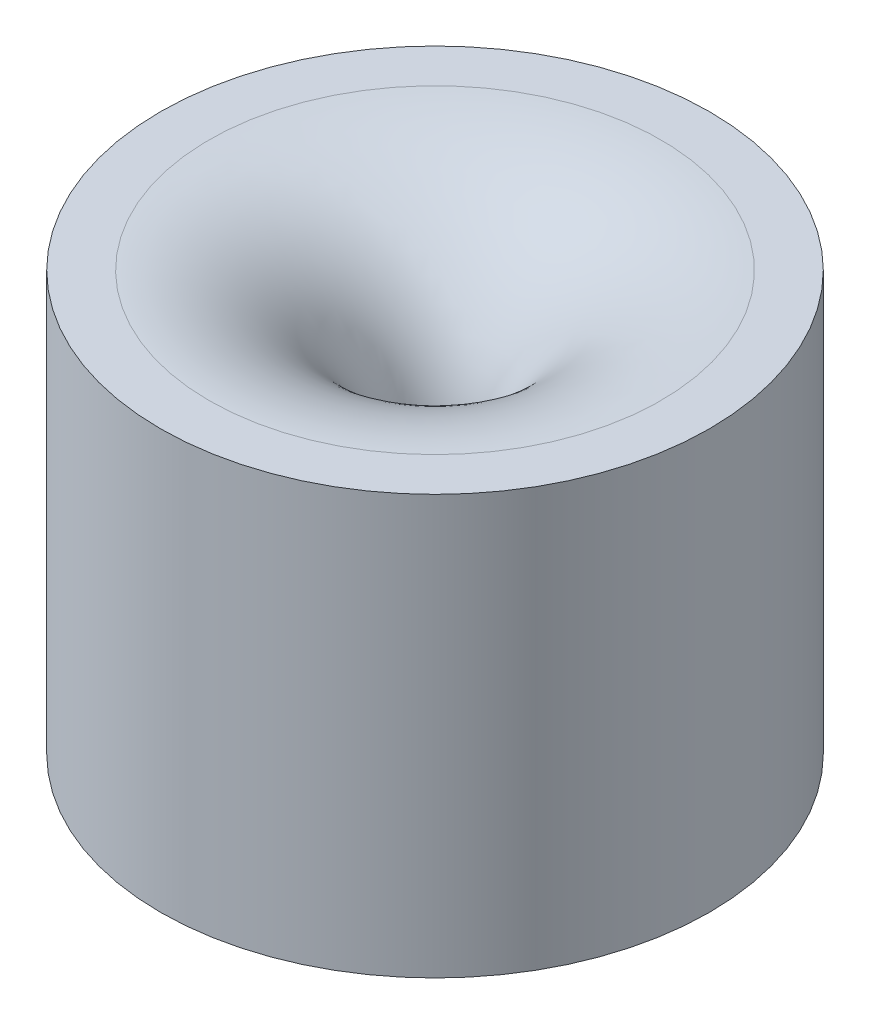
ISO-10303-21;
HEADER;
FILE_DESCRIPTION(('STEP AP214'),'2;1');
FILE_NAME('part.step','',(''),(''),'','','');
FILE_SCHEMA(('AUTOMOTIVE_DESIGN { 1 0 10303 214 1 1 1 1 }'));
ENDSEC;
DATA;
#1=APPLICATION_CONTEXT('core data for automotive mechanical design processes');
#2=APPLICATION_PROTOCOL_DEFINITION('international standard','automotive_design',2000,#1);
#3=PRODUCT_CONTEXT('',#1,'mechanical');
#4=PRODUCT('Part','Part','',(#3));
#5=PRODUCT_RELATED_PRODUCT_CATEGORY('part','',(#4));
#6=PRODUCT_DEFINITION_FORMATION('','',#4);
#7=PRODUCT_DEFINITION_CONTEXT('part definition',#1,'design');
#8=PRODUCT_DEFINITION('design','',#6,#7);
#9=PRODUCT_DEFINITION_SHAPE('','',#8);
#10=(LENGTH_UNIT() NAMED_UNIT(*) SI_UNIT(.MILLI.,.METRE.));
#11=(NAMED_UNIT(*) PLANE_ANGLE_UNIT() SI_UNIT($,.RADIAN.));
#12=(NAMED_UNIT(*) SI_UNIT($,.STERADIAN.) SOLID_ANGLE_UNIT());
#13=UNCERTAINTY_MEASURE_WITH_UNIT(LENGTH_MEASURE(1.E-05),#10,'distance_accuracy_value','');
#14=(GEOMETRIC_REPRESENTATION_CONTEXT(3) GLOBAL_UNCERTAINTY_ASSIGNED_CONTEXT((#13)) GLOBAL_UNIT_ASSIGNED_CONTEXT((#10,
#11,#12)) REPRESENTATION_CONTEXT('',''));
#15=CARTESIAN_POINT('',(0.,0.,0.));
#16=DIRECTION('',(0.,0.,1.));
#17=DIRECTION('',(1.,0.,0.));
#18=AXIS2_PLACEMENT_3D('',#15,#16,#17);
#19=CARTESIAN_POINT('',(0.,44.5,0.));
#20=DIRECTION('',(0.,-1.,0.));
#21=DIRECTION('',(0.,0.,-1.));
#22=AXIS2_PLACEMENT_3D('',#19,#20,#21);
#23=CYLINDRICAL_SURFACE('',#22,4.);
#24=CARTESIAN_POINT('',(0.,24.5,0.));
#25=DIRECTION('',(0.,1.,0.));
#26=DIRECTION('',(0.,0.,1.));
#27=AXIS2_PLACEMENT_3D('',#24,#25,#26);
#28=CIRCLE('',#27,4.);
#29=CARTESIAN_POINT('',(0.,24.5,4.));
#30=VERTEX_POINT('',#29);
#31=EDGE_CURVE('E52',#30,#30,#28,.T.);
#32=ORIENTED_EDGE('',*,*,#31,.T.);
#33=EDGE_LOOP('',(#32));
#34=FACE_BOUND('',#33,.T.);
#35=CARTESIAN_POINT('',(0.,10.,0.));
#36=DIRECTION('',(0.,-1.,0.));
#37=DIRECTION('',(0.,0.,-1.));
#38=AXIS2_PLACEMENT_3D('',#35,#36,#37);
#39=CIRCLE('',#38,4.);
#40=CARTESIAN_POINT('',(0.,10.,-4.));
#41=VERTEX_POINT('',#40);
#42=EDGE_CURVE('E47',#41,#41,#39,.T.);
#43=ORIENTED_EDGE('',*,*,#42,.T.);
#44=EDGE_LOOP('',(#43));
#45=FACE_BOUND('',#44,.T.);
#46=ADVANCED_FACE('F43',(#34,#45),#23,.F.);
#47=CARTESIAN_POINT('',(0.,44.5,0.));
#48=DIRECTION('',(0.,1.,0.));
#49=DIRECTION('',(0.,0.,1.));
#50=AXIS2_PLACEMENT_3D('',#47,#48,#49);
#51=PLANE('',#50);
#52=CARTESIAN_POINT('',(0.,44.5,0.));
#53=DIRECTION('',(0.,1.,0.));
#54=DIRECTION('',(0.,0.,1.));
#55=AXIS2_PLACEMENT_3D('',#52,#53,#54);
#56=CIRCLE('',#55,24.);
#57=CARTESIAN_POINT('',(0.,44.5,24.));
#58=VERTEX_POINT('',#57);
#59=EDGE_CURVE('E10',#58,#58,#56,.F.);
#60=ORIENTED_EDGE('',*,*,#59,.T.);
#61=EDGE_LOOP('',(#60));
#62=FACE_BOUND('',#61,.T.);
#63=CARTESIAN_POINT('',(0.,44.5,0.));
#64=DIRECTION('',(0.,1.,0.));
#65=DIRECTION('',(0.,0.,1.));
#66=AXIS2_PLACEMENT_3D('',#63,#64,#65);
#67=CIRCLE('',#66,29.175);
#68=CARTESIAN_POINT('',(0.,44.5,29.175));
#69=VERTEX_POINT('',#68);
#70=EDGE_CURVE('E57',#69,#69,#67,.T.);
#71=ORIENTED_EDGE('',*,*,#70,.T.);
#72=EDGE_LOOP('',(#71));
#73=FACE_BOUND('',#72,.T.);
#74=ADVANCED_FACE('F91',(#62,#73),#51,.T.);
#75=CARTESIAN_POINT('',(0.,0.,0.));
#76=DIRECTION('',(0.,1.,0.));
#77=DIRECTION('',(0.,0.,1.));
#78=AXIS2_PLACEMENT_3D('',#75,#76,#77);
#79=PLANE('',#78);
#80=CARTESIAN_POINT('',(0.,0.,0.));
#81=DIRECTION('',(0.,-1.,0.));
#82=DIRECTION('',(0.,0.,-1.));
#83=AXIS2_PLACEMENT_3D('',#80,#81,#82);
#84=CIRCLE('',#83,11.);
#85=CARTESIAN_POINT('',(0.,0.,-11.));
#86=VERTEX_POINT('',#85);
#87=EDGE_CURVE('E67',#86,#86,#84,.T.);
#88=ORIENTED_EDGE('',*,*,#87,.F.);
#89=EDGE_LOOP('',(#88));
#90=FACE_BOUND('',#89,.T.);
#91=CARTESIAN_POINT('',(0.,0.,0.));
#92=DIRECTION('',(0.,1.,0.));
#93=DIRECTION('',(0.,0.,1.));
#94=AXIS2_PLACEMENT_3D('',#91,#92,#93);
#95=CIRCLE('',#94,29.175);
#96=CARTESIAN_POINT('',(0.,0.,29.175));
#97=VERTEX_POINT('',#96);
#98=EDGE_CURVE('E60',#97,#97,#95,.T.);
#99=ORIENTED_EDGE('',*,*,#98,.F.);
#100=EDGE_LOOP('',(#99));
#101=FACE_BOUND('',#100,.T.);
#102=ADVANCED_FACE('F97',(#90,#101),#79,.F.);
#103=CARTESIAN_POINT('',(0.,44.5,0.));
#104=DIRECTION('',(0.,-1.,0.));
#105=DIRECTION('',(0.,0.,-1.));
#106=AXIS2_PLACEMENT_3D('',#103,#104,#105);
#107=CYLINDRICAL_SURFACE('',#106,29.175);
#108=ORIENTED_EDGE('',*,*,#70,.F.);
#109=EDGE_LOOP('',(#108));
#110=FACE_BOUND('',#109,.T.);
#111=ORIENTED_EDGE('',*,*,#98,.T.);
#112=EDGE_LOOP('',(#111));
#113=FACE_BOUND('',#112,.T.);
#114=ADVANCED_FACE('F101',(#110,#113),#107,.T.);
#115=CARTESIAN_POINT('',(0.,24.5,0.));
#116=DIRECTION('',(0.,1.,0.));
#117=DIRECTION('',(0.,0.,1.));
#118=AXIS2_PLACEMENT_3D('',#115,#116,#117);
#119=TOROIDAL_SURFACE('',#118,24.,20.);
#120=ORIENTED_EDGE('',*,*,#59,.F.);
#121=EDGE_LOOP('',(#120));
#122=FACE_BOUND('',#121,.T.);
#123=ORIENTED_EDGE('',*,*,#31,.F.);
#124=EDGE_LOOP('',(#123));
#125=FACE_BOUND('',#124,.T.);
#126=ADVANCED_FACE('F45',(#122,#125),#119,.T.);
#127=CARTESIAN_POINT('',(0.,10.,0.));
#128=DIRECTION('',(0.,-1.,0.));
#129=DIRECTION('',(0.,0.,-1.));
#130=AXIS2_PLACEMENT_3D('',#127,#128,#129);
#131=CYLINDRICAL_SURFACE('',#130,11.);
#132=CARTESIAN_POINT('',(0.,10.,0.));
#133=DIRECTION('',(0.,-1.,0.));
#134=DIRECTION('',(0.,0.,-1.));
#135=AXIS2_PLACEMENT_3D('',#132,#133,#134);
#136=CIRCLE('',#135,11.);
#137=CARTESIAN_POINT('',(0.,10.,-11.));
#138=VERTEX_POINT('',#137);
#139=EDGE_CURVE('E71',#138,#138,#136,.T.);
#140=ORIENTED_EDGE('',*,*,#139,.F.);
#141=EDGE_LOOP('',(#140));
#142=FACE_BOUND('',#141,.T.);
#143=ORIENTED_EDGE('',*,*,#87,.T.);
#144=EDGE_LOOP('',(#143));
#145=FACE_BOUND('',#144,.T.);
#146=ADVANCED_FACE('F83',(#142,#145),#131,.F.);
#147=CARTESIAN_POINT('',(0.,10.,0.));
#148=DIRECTION('',(0.,-1.,0.));
#149=DIRECTION('',(0.,0.,-1.));
#150=AXIS2_PLACEMENT_3D('',#147,#148,#149);
#151=PLANE('',#150);
#152=ORIENTED_EDGE('',*,*,#42,.F.);
#153=EDGE_LOOP('',(#152));
#154=FACE_BOUND('',#153,.T.);
#155=ORIENTED_EDGE('',*,*,#139,.T.);
#156=EDGE_LOOP('',(#155));
#157=FACE_BOUND('',#156,.T.);
#158=ADVANCED_FACE('F81',(#154,#157),#151,.T.);
#159=CLOSED_SHELL('',(#46,#74,#102,#114,#126,#146,#158));
#160=MANIFOLD_SOLID_BREP('B2',#159);
#161=ADVANCED_BREP_SHAPE_REPRESENTATION('',(#18,#160),#14);
#162=SHAPE_DEFINITION_REPRESENTATION(#9,#161);
ENDSEC;
END-ISO-10303-21;
